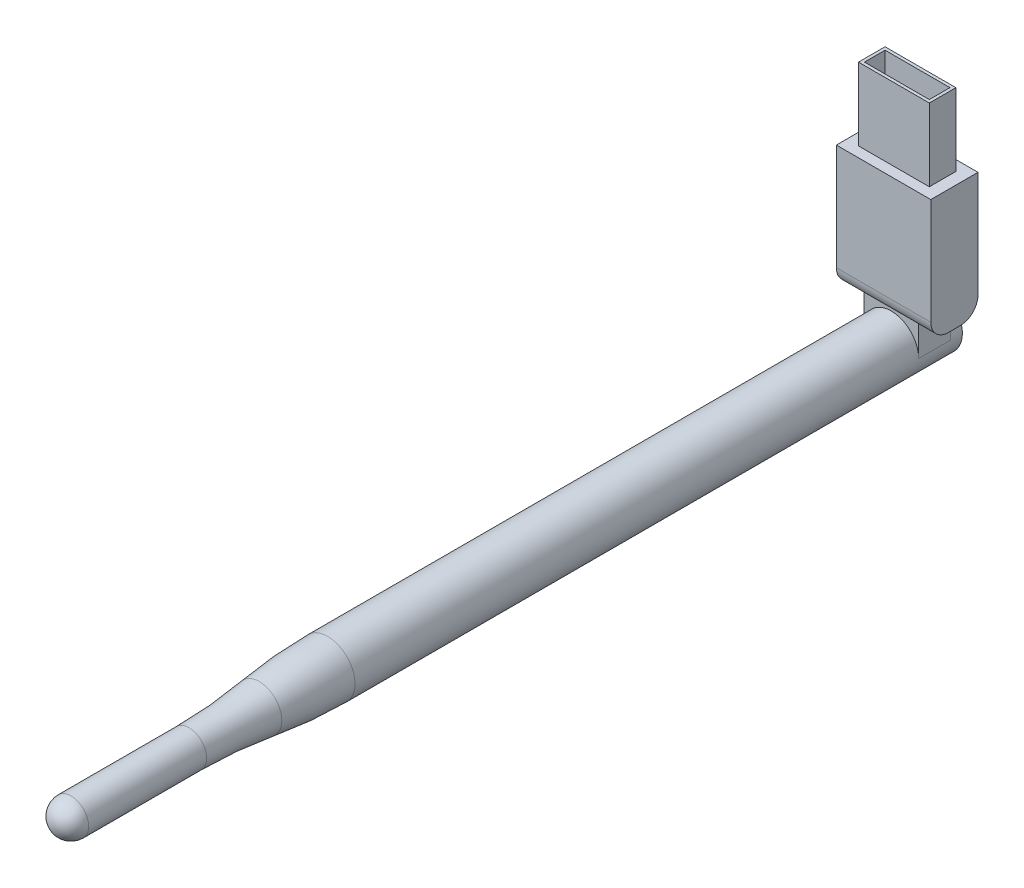
ISO-10303-21;
HEADER;
FILE_DESCRIPTION(('STEP AP214'),'2;1');
FILE_NAME('part.step','',(''),(''),'','','');
FILE_SCHEMA(('AUTOMOTIVE_DESIGN { 1 0 10303 214 1 1 1 1 }'));
ENDSEC;
DATA;
#1=APPLICATION_CONTEXT('core data for automotive mechanical design processes');
#2=APPLICATION_PROTOCOL_DEFINITION('international standard','automotive_design',2000,#1);
#3=PRODUCT_CONTEXT('',#1,'mechanical');
#4=PRODUCT('Part','Part','',(#3));
#5=PRODUCT_RELATED_PRODUCT_CATEGORY('part','',(#4));
#6=PRODUCT_DEFINITION_FORMATION('','',#4);
#7=PRODUCT_DEFINITION_CONTEXT('part definition',#1,'design');
#8=PRODUCT_DEFINITION('design','',#6,#7);
#9=PRODUCT_DEFINITION_SHAPE('','',#8);
#10=(LENGTH_UNIT() NAMED_UNIT(*) SI_UNIT(.MILLI.,.METRE.));
#11=(NAMED_UNIT(*) PLANE_ANGLE_UNIT() SI_UNIT($,.RADIAN.));
#12=(NAMED_UNIT(*) SI_UNIT($,.STERADIAN.) SOLID_ANGLE_UNIT());
#13=UNCERTAINTY_MEASURE_WITH_UNIT(LENGTH_MEASURE(1.E-05),#10,'distance_accuracy_value','');
#14=(GEOMETRIC_REPRESENTATION_CONTEXT(3) GLOBAL_UNCERTAINTY_ASSIGNED_CONTEXT((#13)) GLOBAL_UNIT_ASSIGNED_CONTEXT((#10,
#11,#12)) REPRESENTATION_CONTEXT('',''));
#15=CARTESIAN_POINT('',(0.,0.,0.));
#16=DIRECTION('',(0.,0.,1.));
#17=DIRECTION('',(1.,0.,0.));
#18=AXIS2_PLACEMENT_3D('',#15,#16,#17);
#19=CARTESIAN_POINT('',(0.,22.8,0.));
#20=DIRECTION('',(0.,1.,0.));
#21=DIRECTION('',(0.,0.,1.));
#22=AXIS2_PLACEMENT_3D('',#19,#20,#21);
#23=PLANE('',#22);
#24=DIRECTION('',(0.,0.,-1.));
#25=VECTOR('',#24,1.);
#26=CARTESIAN_POINT('',(6.,22.8,1.75));
#27=LINE('',#26,#25);
#28=CARTESIAN_POINT('',(6.,22.8,6.25));
#29=VERTEX_POINT('',#28);
#30=CARTESIAN_POINT('',(6.,22.8,1.75));
#31=VERTEX_POINT('',#30);
#32=EDGE_CURVE('E304',#29,#31,#27,.T.);
#33=ORIENTED_EDGE('',*,*,#32,.T.);
#34=DIRECTION('',(-1.,0.,0.));
#35=VECTOR('',#34,1.);
#36=CARTESIAN_POINT('',(-6.,22.8,1.75));
#37=LINE('',#36,#35);
#38=CARTESIAN_POINT('',(-6.,22.8,1.75));
#39=VERTEX_POINT('',#38);
#40=EDGE_CURVE('E307',#31,#39,#37,.T.);
#41=ORIENTED_EDGE('',*,*,#40,.T.);
#42=DIRECTION('',(0.,0.,1.));
#43=VECTOR('',#42,1.);
#44=CARTESIAN_POINT('',(-6.,22.8,1.75));
#45=LINE('',#44,#43);
#46=CARTESIAN_POINT('',(-6.,22.8,6.25));
#47=VERTEX_POINT('',#46);
#48=EDGE_CURVE('E310',#39,#47,#45,.T.);
#49=ORIENTED_EDGE('',*,*,#48,.T.);
#50=DIRECTION('',(1.,0.,0.));
#51=VECTOR('',#50,1.);
#52=CARTESIAN_POINT('',(-6.,22.8,6.25));
#53=LINE('',#52,#51);
#54=EDGE_CURVE('E312',#47,#29,#53,.T.);
#55=ORIENTED_EDGE('',*,*,#54,.T.);
#56=EDGE_LOOP('',(#33,#41,#49,#55));
#57=FACE_BOUND('',#56,.T.);
#58=DIRECTION('',(0.,0.,-1.));
#59=VECTOR('',#58,1.);
#60=CARTESIAN_POINT('',(5.5,22.8,5.75));
#61=LINE('',#60,#59);
#62=CARTESIAN_POINT('',(5.5,22.8,5.75));
#63=VERTEX_POINT('',#62);
#64=CARTESIAN_POINT('',(5.5,22.8,2.25));
#65=VERTEX_POINT('',#64);
#66=EDGE_CURVE('E206',#63,#65,#61,.T.);
#67=ORIENTED_EDGE('',*,*,#66,.F.);
#68=DIRECTION('',(1.,0.,0.));
#69=VECTOR('',#68,1.);
#70=CARTESIAN_POINT('',(-5.5,22.8,5.75));
#71=LINE('',#70,#69);
#72=CARTESIAN_POINT('',(-5.5,22.8,5.75));
#73=VERTEX_POINT('',#72);
#74=EDGE_CURVE('E195',#73,#63,#71,.T.);
#75=ORIENTED_EDGE('',*,*,#74,.F.);
#76=DIRECTION('',(0.,0.,1.));
#77=VECTOR('',#76,1.);
#78=CARTESIAN_POINT('',(-5.5,22.8,2.25));
#79=LINE('',#78,#77);
#80=CARTESIAN_POINT('',(-5.5,22.8,2.25));
#81=VERTEX_POINT('',#80);
#82=EDGE_CURVE('E220',#81,#73,#79,.T.);
#83=ORIENTED_EDGE('',*,*,#82,.F.);
#84=DIRECTION('',(-1.,0.,0.));
#85=VECTOR('',#84,1.);
#86=CARTESIAN_POINT('',(5.5,22.8,2.25));
#87=LINE('',#86,#85);
#88=EDGE_CURVE('E218',#65,#81,#87,.T.);
#89=ORIENTED_EDGE('',*,*,#88,.F.);
#90=EDGE_LOOP('',(#67,#75,#83,#89));
#91=FACE_BOUND('',#90,.T.);
#92=ADVANCED_FACE('F55',(#57,#91),#23,.T.);
#93=CARTESIAN_POINT('',(4.65,1.8,6.7));
#94=DIRECTION('',(1.,0.,0.));
#95=DIRECTION('',(0.,0.,-1.));
#96=AXIS2_PLACEMENT_3D('',#93,#94,#95);
#97=PLANE('',#96);
#98=DIRECTION('',(0.,-1.,0.));
#99=VECTOR('',#98,1.);
#100=CARTESIAN_POINT('',(4.65,1.8,6.7));
#101=LINE('',#100,#99);
#102=CARTESIAN_POINT('',(4.65,-9.97184141886166,6.7));
#103=VERTEX_POINT('',#102);
#104=CARTESIAN_POINT('',(4.65,-15.15,6.7));
#105=VERTEX_POINT('',#104);
#106=EDGE_CURVE('E78',#103,#105,#101,.T.);
#107=ORIENTED_EDGE('',*,*,#106,.T.);
#108=DIRECTION('',(0.,0.,1.));
#109=VECTOR('',#108,1.);
#110=CARTESIAN_POINT('',(4.65,-15.15,-0.699999999999997));
#111=LINE('',#110,#109);
#112=CARTESIAN_POINT('',(4.65,-15.15,1.3));
#113=VERTEX_POINT('',#112);
#114=EDGE_CURVE('E214',#113,#105,#111,.T.);
#115=ORIENTED_EDGE('',*,*,#114,.F.);
#116=DIRECTION('',(0.,-1.,0.));
#117=VECTOR('',#116,1.);
#118=CARTESIAN_POINT('',(4.65,1.8,1.3));
#119=LINE('',#118,#117);
#120=CARTESIAN_POINT('',(4.65,-9.97184141886166,1.3));
#121=VERTEX_POINT('',#120);
#122=EDGE_CURVE('E257',#121,#113,#119,.T.);
#123=ORIENTED_EDGE('',*,*,#122,.F.);
#124=CARTESIAN_POINT('',(4.65,-7.5,3.));
#125=DIRECTION('',(1.,0.,0.));
#126=DIRECTION('',(0.,0.,-1.));
#127=AXIS2_PLACEMENT_3D('',#124,#125,#126);
#128=CIRCLE('',#127,3.);
#129=CARTESIAN_POINT('',(4.65,-10.5,3.));
#130=VERTEX_POINT('',#129);
#131=EDGE_CURVE('E276',#130,#121,#128,.T.);
#132=ORIENTED_EDGE('',*,*,#131,.F.);
#133=DIRECTION('',(0.,0.,-1.));
#134=VECTOR('',#133,1.);
#135=CARTESIAN_POINT('',(4.65,-10.5,8.));
#136=LINE('',#135,#134);
#137=CARTESIAN_POINT('',(4.65,-10.5,4.99999999999998));
#138=VERTEX_POINT('',#137);
#139=EDGE_CURVE('E273',#138,#130,#136,.T.);
#140=ORIENTED_EDGE('',*,*,#139,.F.);
#141=CARTESIAN_POINT('',(4.65,-7.5,5.));
#142=DIRECTION('',(1.,0.,0.));
#143=DIRECTION('',(0.,0.,-1.));
#144=AXIS2_PLACEMENT_3D('',#141,#142,#143);
#145=CIRCLE('',#144,3.);
#146=EDGE_CURVE('E63',#103,#138,#145,.T.);
#147=ORIENTED_EDGE('',*,*,#146,.F.);
#148=EDGE_LOOP('',(#107,#115,#123,#132,#140,#147));
#149=FACE_BOUND('',#148,.T.);
#150=ADVANCED_FACE('F404',(#149),#97,.T.);
#151=CARTESIAN_POINT('',(-4.65,1.8,6.7));
#152=DIRECTION('',(-1.,0.,0.));
#153=DIRECTION('',(0.,0.,1.));
#154=AXIS2_PLACEMENT_3D('',#151,#152,#153);
#155=PLANE('',#154);
#156=DIRECTION('',(0.,-1.,0.));
#157=VECTOR('',#156,1.);
#158=CARTESIAN_POINT('',(-4.65,1.8,1.3));
#159=LINE('',#158,#157);
#160=CARTESIAN_POINT('',(-4.65,-9.97184141886166,1.3));
#161=VERTEX_POINT('',#160);
#162=CARTESIAN_POINT('',(-4.65,-15.15,1.3));
#163=VERTEX_POINT('',#162);
#164=EDGE_CURVE('E261',#161,#163,#159,.T.);
#165=ORIENTED_EDGE('',*,*,#164,.T.);
#166=DIRECTION('',(0.,0.,1.));
#167=VECTOR('',#166,1.);
#168=CARTESIAN_POINT('',(-4.65,-15.15,-0.699999999999997));
#169=LINE('',#168,#167);
#170=CARTESIAN_POINT('',(-4.65,-15.15,6.7));
#171=VERTEX_POINT('',#170);
#172=EDGE_CURVE('E234',#163,#171,#169,.T.);
#173=ORIENTED_EDGE('',*,*,#172,.T.);
#174=DIRECTION('',(0.,-1.,0.));
#175=VECTOR('',#174,1.);
#176=CARTESIAN_POINT('',(-4.65,1.8,6.7));
#177=LINE('',#176,#175);
#178=CARTESIAN_POINT('',(-4.65,-9.97184141886166,6.7));
#179=VERTEX_POINT('',#178);
#180=EDGE_CURVE('E264',#179,#171,#177,.T.);
#181=ORIENTED_EDGE('',*,*,#180,.F.);
#182=CARTESIAN_POINT('',(-4.65,-7.5,5.));
#183=DIRECTION('',(-1.,0.,0.));
#184=DIRECTION('',(0.,0.,1.));
#185=AXIS2_PLACEMENT_3D('',#182,#183,#184);
#186=CIRCLE('',#185,3.);
#187=CARTESIAN_POINT('',(-4.65,-10.5,4.99999999999998));
#188=VERTEX_POINT('',#187);
#189=EDGE_CURVE('E365',#188,#179,#186,.T.);
#190=ORIENTED_EDGE('',*,*,#189,.F.);
#191=DIRECTION('',(0.,0.,1.));
#192=VECTOR('',#191,1.);
#193=CARTESIAN_POINT('',(-4.65,-10.5,8.));
#194=LINE('',#193,#192);
#195=CARTESIAN_POINT('',(-4.65,-10.5,3.));
#196=VERTEX_POINT('',#195);
#197=EDGE_CURVE('E260',#196,#188,#194,.T.);
#198=ORIENTED_EDGE('',*,*,#197,.F.);
#199=CARTESIAN_POINT('',(-4.65,-7.5,3.));
#200=DIRECTION('',(-1.,0.,0.));
#201=DIRECTION('',(0.,0.,1.));
#202=AXIS2_PLACEMENT_3D('',#199,#200,#201);
#203=CIRCLE('',#202,3.);
#204=EDGE_CURVE('E270',#161,#196,#203,.T.);
#205=ORIENTED_EDGE('',*,*,#204,.F.);
#206=EDGE_LOOP('',(#165,#173,#181,#190,#198,#205));
#207=FACE_BOUND('',#206,.T.);
#208=ADVANCED_FACE('F395',(#207),#155,.T.);
#209=CARTESIAN_POINT('',(-4.65,1.8,1.3));
#210=DIRECTION('',(0.,0.,-1.));
#211=DIRECTION('',(-1.,0.,0.));
#212=AXIS2_PLACEMENT_3D('',#209,#210,#211);
#213=PLANE('',#212);
#214=CARTESIAN_POINT('',(0.,-15.15,1.3));
#215=DIRECTION('',(0.,0.,-1.));
#216=DIRECTION('',(-1.,0.,0.));
#217=AXIS2_PLACEMENT_3D('',#214,#215,#216);
#218=CIRCLE('',#217,4.65);
#219=EDGE_CURVE('E254',#163,#113,#218,.T.);
#220=ORIENTED_EDGE('',*,*,#219,.F.);
#221=ORIENTED_EDGE('',*,*,#164,.F.);
#222=DIRECTION('',(1.,0.,0.));
#223=VECTOR('',#222,1.);
#224=CARTESIAN_POINT('',(-8.,-9.97184141886166,1.3));
#225=LINE('',#224,#223);
#226=EDGE_CURVE('E12',#121,#161,#225,.F.);
#227=ORIENTED_EDGE('',*,*,#226,.F.);
#228=ORIENTED_EDGE('',*,*,#122,.T.);
#229=EDGE_LOOP('',(#220,#221,#227,#228));
#230=FACE_BOUND('',#229,.T.);
#231=ADVANCED_FACE('F403',(#230),#213,.T.);
#232=CARTESIAN_POINT('',(-4.65,1.8,6.7));
#233=DIRECTION('',(0.,0.,1.));
#234=DIRECTION('',(1.,0.,0.));
#235=AXIS2_PLACEMENT_3D('',#232,#233,#234);
#236=PLANE('',#235);
#237=CARTESIAN_POINT('',(0.,-15.15,6.7));
#238=DIRECTION('',(0.,0.,1.));
#239=DIRECTION('',(1.,0.,0.));
#240=AXIS2_PLACEMENT_3D('',#237,#238,#239);
#241=CIRCLE('',#240,4.65);
#242=EDGE_CURVE('E251',#105,#171,#241,.T.);
#243=ORIENTED_EDGE('',*,*,#242,.F.);
#244=ORIENTED_EDGE('',*,*,#106,.F.);
#245=DIRECTION('',(1.,0.,0.));
#246=VECTOR('',#245,1.);
#247=CARTESIAN_POINT('',(-8.,-9.97184141886166,6.7));
#248=LINE('',#247,#246);
#249=EDGE_CURVE('E362',#179,#103,#248,.T.);
#250=ORIENTED_EDGE('',*,*,#249,.F.);
#251=ORIENTED_EDGE('',*,*,#180,.T.);
#252=EDGE_LOOP('',(#243,#244,#250,#251));
#253=FACE_BOUND('',#252,.T.);
#254=ADVANCED_FACE('F408',(#253),#236,.T.);
#255=CARTESIAN_POINT('',(-8.,-10.5,8.));
#256=DIRECTION('',(0.,1.,0.));
#257=DIRECTION('',(0.,0.,1.));
#258=AXIS2_PLACEMENT_3D('',#255,#256,#257);
#259=PLANE('',#258);
#260=DIRECTION('',(1.,0.,0.));
#261=VECTOR('',#260,1.);
#262=CARTESIAN_POINT('',(-8.,-10.5,4.99999999999998));
#263=LINE('',#262,#261);
#264=CARTESIAN_POINT('',(8.,-10.5,4.99999999999998));
#265=VERTEX_POINT('',#264);
#266=EDGE_CURVE('E295',#138,#265,#263,.T.);
#267=ORIENTED_EDGE('',*,*,#266,.F.);
#268=ORIENTED_EDGE('',*,*,#139,.T.);
#269=DIRECTION('',(1.,0.,0.));
#270=VECTOR('',#269,1.);
#271=CARTESIAN_POINT('',(-8.,-10.5,3.00000000000002));
#272=LINE('',#271,#270);
#273=CARTESIAN_POINT('',(8.,-10.5,3.00000000000002));
#274=VERTEX_POINT('',#273);
#275=EDGE_CURVE('E299',#130,#274,#272,.T.);
#276=ORIENTED_EDGE('',*,*,#275,.T.);
#277=DIRECTION('',(0.,0.,-1.));
#278=VECTOR('',#277,1.);
#279=CARTESIAN_POINT('',(8.,-10.5,8.));
#280=LINE('',#279,#278);
#281=EDGE_CURVE('E345',#265,#274,#280,.T.);
#282=ORIENTED_EDGE('',*,*,#281,.F.);
#283=EDGE_LOOP('',(#267,#268,#276,#282));
#284=FACE_BOUND('',#283,.T.);
#285=ADVANCED_FACE('F375',(#284),#259,.F.);
#286=CARTESIAN_POINT('',(-8.,-10.5,3.00000000000002));
#287=VERTEX_POINT('',#286);
#288=EDGE_CURVE('E296',#287,#196,#272,.T.);
#289=ORIENTED_EDGE('',*,*,#288,.T.);
#290=ORIENTED_EDGE('',*,*,#197,.T.);
#291=CARTESIAN_POINT('',(-8.,-10.5,4.99999999999998));
#292=VERTEX_POINT('',#291);
#293=EDGE_CURVE('E291',#292,#188,#263,.T.);
#294=ORIENTED_EDGE('',*,*,#293,.F.);
#295=DIRECTION('',(0.,0.,-1.));
#296=VECTOR('',#295,1.);
#297=CARTESIAN_POINT('',(-8.,-10.5,8.));
#298=LINE('',#297,#296);
#299=EDGE_CURVE('E353',#292,#287,#298,.T.);
#300=ORIENTED_EDGE('',*,*,#299,.T.);
#301=EDGE_LOOP('',(#289,#290,#294,#300));
#302=FACE_BOUND('',#301,.T.);
#303=ADVANCED_FACE('F393',(#302),#259,.F.);
#304=CARTESIAN_POINT('',(-8.,10.5,8.));
#305=DIRECTION('',(0.,-1.,0.));
#306=DIRECTION('',(0.,0.,-1.));
#307=AXIS2_PLACEMENT_3D('',#304,#305,#306);
#308=PLANE('',#307);
#309=DIRECTION('',(-1.,0.,0.));
#310=VECTOR('',#309,1.);
#311=CARTESIAN_POINT('',(-8.,10.5,0.));
#312=LINE('',#311,#310);
#313=CARTESIAN_POINT('',(8.,10.5,0.));
#314=VERTEX_POINT('',#313);
#315=CARTESIAN_POINT('',(-8.,10.5,0.));
#316=VERTEX_POINT('',#315);
#317=EDGE_CURVE('E347',#314,#316,#312,.T.);
#318=ORIENTED_EDGE('',*,*,#317,.T.);
#319=DIRECTION('',(0.,0.,-1.));
#320=VECTOR('',#319,1.);
#321=CARTESIAN_POINT('',(-8.,10.5,8.));
#322=LINE('',#321,#320);
#323=CARTESIAN_POINT('',(-8.,10.5,8.));
#324=VERTEX_POINT('',#323);
#325=EDGE_CURVE('E356',#324,#316,#322,.T.);
#326=ORIENTED_EDGE('',*,*,#325,.F.);
#327=DIRECTION('',(-1.,0.,0.));
#328=VECTOR('',#327,1.);
#329=CARTESIAN_POINT('',(-8.,10.5,8.));
#330=LINE('',#329,#328);
#331=CARTESIAN_POINT('',(8.,10.5,8.));
#332=VERTEX_POINT('',#331);
#333=EDGE_CURVE('E339',#332,#324,#330,.T.);
#334=ORIENTED_EDGE('',*,*,#333,.F.);
#335=DIRECTION('',(0.,0.,-1.));
#336=VECTOR('',#335,1.);
#337=CARTESIAN_POINT('',(8.,10.5,8.));
#338=LINE('',#337,#336);
#339=EDGE_CURVE('E359',#332,#314,#338,.T.);
#340=ORIENTED_EDGE('',*,*,#339,.T.);
#341=EDGE_LOOP('',(#318,#326,#334,#340));
#342=FACE_BOUND('',#341,.T.);
#343=DIRECTION('',(0.,0.,-1.));
#344=VECTOR('',#343,1.);
#345=CARTESIAN_POINT('',(6.,10.5,1.75));
#346=LINE('',#345,#344);
#347=CARTESIAN_POINT('',(6.,10.5,6.25));
#348=VERTEX_POINT('',#347);
#349=CARTESIAN_POINT('',(6.,10.5,1.75));
#350=VERTEX_POINT('',#349);
#351=EDGE_CURVE('E294',#348,#350,#346,.T.);
#352=ORIENTED_EDGE('',*,*,#351,.F.);
#353=DIRECTION('',(1.,0.,0.));
#354=VECTOR('',#353,1.);
#355=CARTESIAN_POINT('',(-6.,10.5,6.25));
#356=LINE('',#355,#354);
#357=CARTESIAN_POINT('',(-6.,10.5,6.25));
#358=VERTEX_POINT('',#357);
#359=EDGE_CURVE('E308',#358,#348,#356,.T.);
#360=ORIENTED_EDGE('',*,*,#359,.F.);
#361=DIRECTION('',(0.,0.,1.));
#362=VECTOR('',#361,1.);
#363=CARTESIAN_POINT('',(-6.,10.5,1.75));
#364=LINE('',#363,#362);
#365=CARTESIAN_POINT('',(-6.,10.5,1.75));
#366=VERTEX_POINT('',#365);
#367=EDGE_CURVE('E320',#366,#358,#364,.T.);
#368=ORIENTED_EDGE('',*,*,#367,.F.);
#369=DIRECTION('',(-1.,0.,0.));
#370=VECTOR('',#369,1.);
#371=CARTESIAN_POINT('',(-6.,10.5,1.75));
#372=LINE('',#371,#370);
#373=EDGE_CURVE('E317',#350,#366,#372,.T.);
#374=ORIENTED_EDGE('',*,*,#373,.F.);
#375=EDGE_LOOP('',(#352,#360,#368,#374));
#376=FACE_BOUND('',#375,.T.);
#377=ADVANCED_FACE('F451',(#342,#376),#308,.F.);
#378=CARTESIAN_POINT('',(8.,10.5,8.));
#379=DIRECTION('',(-1.,0.,0.));
#380=DIRECTION('',(0.,-1.,0.));
#381=AXIS2_PLACEMENT_3D('',#378,#379,#380);
#382=PLANE('',#381);
#383=DIRECTION('',(0.,1.,0.));
#384=VECTOR('',#383,1.);
#385=CARTESIAN_POINT('',(8.,10.5,8.));
#386=LINE('',#385,#384);
#387=CARTESIAN_POINT('',(8.,-7.49999999999998,8.));
#388=VERTEX_POINT('',#387);
#389=EDGE_CURVE('E337',#388,#332,#386,.T.);
#390=ORIENTED_EDGE('',*,*,#389,.F.);
#391=CARTESIAN_POINT('',(8.,-7.5,5.));
#392=DIRECTION('',(-1.,0.,0.));
#393=DIRECTION('',(0.,1.,0.));
#394=AXIS2_PLACEMENT_3D('',#391,#392,#393);
#395=CIRCLE('',#394,3.);
#396=EDGE_CURVE('E279',#265,#388,#395,.T.);
#397=ORIENTED_EDGE('',*,*,#396,.F.);
#398=ORIENTED_EDGE('',*,*,#281,.T.);
#399=CARTESIAN_POINT('',(8.,-7.5,3.));
#400=DIRECTION('',(-1.,0.,0.));
#401=DIRECTION('',(0.,-1.,0.));
#402=AXIS2_PLACEMENT_3D('',#399,#400,#401);
#403=CIRCLE('',#402,3.);
#404=CARTESIAN_POINT('',(8.,-7.49999999999998,0.));
#405=VERTEX_POINT('',#404);
#406=EDGE_CURVE('E284',#405,#274,#403,.T.);
#407=ORIENTED_EDGE('',*,*,#406,.F.);
#408=DIRECTION('',(0.,1.,0.));
#409=VECTOR('',#408,1.);
#410=CARTESIAN_POINT('',(8.,10.5,0.));
#411=LINE('',#410,#409);
#412=EDGE_CURVE('E336',#405,#314,#411,.T.);
#413=ORIENTED_EDGE('',*,*,#412,.T.);
#414=ORIENTED_EDGE('',*,*,#339,.F.);
#415=EDGE_LOOP('',(#390,#397,#398,#407,#413,#414));
#416=FACE_BOUND('',#415,.T.);
#417=ADVANCED_FACE('F57',(#416),#382,.F.);
#418=CARTESIAN_POINT('',(-8.,10.5,8.));
#419=DIRECTION('',(1.,0.,0.));
#420=DIRECTION('',(0.,0.,-1.));
#421=AXIS2_PLACEMENT_3D('',#418,#419,#420);
#422=PLANE('',#421);
#423=ORIENTED_EDGE('',*,*,#299,.F.);
#424=CARTESIAN_POINT('',(-8.,-7.50000000000001,5.));
#425=DIRECTION('',(-1.,0.,0.));
#426=DIRECTION('',(0.,1.,0.));
#427=AXIS2_PLACEMENT_3D('',#424,#425,#426);
#428=CIRCLE('',#427,3.);
#429=CARTESIAN_POINT('',(-8.,-7.49999999999998,8.));
#430=VERTEX_POINT('',#429);
#431=EDGE_CURVE('E280',#292,#430,#428,.T.);
#432=ORIENTED_EDGE('',*,*,#431,.T.);
#433=DIRECTION('',(0.,-1.,0.));
#434=VECTOR('',#433,1.);
#435=CARTESIAN_POINT('',(-8.,10.5,8.));
#436=LINE('',#435,#434);
#437=EDGE_CURVE('E342',#324,#430,#436,.T.);
#438=ORIENTED_EDGE('',*,*,#437,.F.);
#439=ORIENTED_EDGE('',*,*,#325,.T.);
#440=DIRECTION('',(0.,-1.,0.));
#441=VECTOR('',#440,1.);
#442=CARTESIAN_POINT('',(-8.,10.5,0.));
#443=LINE('',#442,#441);
#444=CARTESIAN_POINT('',(-8.,-7.49999999999998,0.));
#445=VERTEX_POINT('',#444);
#446=EDGE_CURVE('E340',#316,#445,#443,.T.);
#447=ORIENTED_EDGE('',*,*,#446,.T.);
#448=CARTESIAN_POINT('',(-8.,-7.50000000000001,3.));
#449=DIRECTION('',(-1.,0.,0.));
#450=DIRECTION('',(0.,-1.,0.));
#451=AXIS2_PLACEMENT_3D('',#448,#449,#450);
#452=CIRCLE('',#451,3.);
#453=EDGE_CURVE('E283',#445,#287,#452,.T.);
#454=ORIENTED_EDGE('',*,*,#453,.T.);
#455=EDGE_LOOP('',(#423,#432,#438,#439,#447,#454));
#456=FACE_BOUND('',#455,.T.);
#457=ADVANCED_FACE('F389',(#456),#422,.F.);
#458=CARTESIAN_POINT('',(0.,0.,8.));
#459=DIRECTION('',(0.,0.,1.));
#460=DIRECTION('',(1.,0.,0.));
#461=AXIS2_PLACEMENT_3D('',#458,#459,#460);
#462=PLANE('',#461);
#463=DIRECTION('',(1.,0.,0.));
#464=VECTOR('',#463,1.);
#465=CARTESIAN_POINT('',(-8.,-7.49999999999998,8.));
#466=LINE('',#465,#464);
#467=EDGE_CURVE('E287',#430,#388,#466,.T.);
#468=ORIENTED_EDGE('',*,*,#467,.T.);
#469=ORIENTED_EDGE('',*,*,#389,.T.);
#470=ORIENTED_EDGE('',*,*,#333,.T.);
#471=ORIENTED_EDGE('',*,*,#437,.T.);
#472=EDGE_LOOP('',(#468,#469,#470,#471));
#473=FACE_BOUND('',#472,.T.);
#474=ADVANCED_FACE('F383',(#473),#462,.T.);
#475=CARTESIAN_POINT('',(0.,0.,0.));
#476=DIRECTION('',(0.,0.,1.));
#477=DIRECTION('',(1.,0.,0.));
#478=AXIS2_PLACEMENT_3D('',#475,#476,#477);
#479=PLANE('',#478);
#480=ORIENTED_EDGE('',*,*,#412,.F.);
#481=DIRECTION('',(1.,0.,0.));
#482=VECTOR('',#481,1.);
#483=CARTESIAN_POINT('',(-8.,-7.49999999999998,0.));
#484=LINE('',#483,#482);
#485=EDGE_CURVE('E300',#445,#405,#484,.T.);
#486=ORIENTED_EDGE('',*,*,#485,.F.);
#487=ORIENTED_EDGE('',*,*,#446,.F.);
#488=ORIENTED_EDGE('',*,*,#317,.F.);
#489=EDGE_LOOP('',(#480,#486,#487,#488));
#490=FACE_BOUND('',#489,.T.);
#491=ADVANCED_FACE('F443',(#490),#479,.F.);
#492=CARTESIAN_POINT('',(6.,22.8,1.75));
#493=DIRECTION('',(-1.,0.,0.));
#494=DIRECTION('',(0.,0.,1.));
#495=AXIS2_PLACEMENT_3D('',#492,#493,#494);
#496=PLANE('',#495);
#497=ORIENTED_EDGE('',*,*,#351,.T.);
#498=DIRECTION('',(0.,-1.,0.));
#499=VECTOR('',#498,1.);
#500=CARTESIAN_POINT('',(6.,22.8,1.75));
#501=LINE('',#500,#499);
#502=EDGE_CURVE('E333',#31,#350,#501,.T.);
#503=ORIENTED_EDGE('',*,*,#502,.F.);
#504=ORIENTED_EDGE('',*,*,#32,.F.);
#505=DIRECTION('',(0.,-1.,0.));
#506=VECTOR('',#505,1.);
#507=CARTESIAN_POINT('',(6.,22.8,6.25));
#508=LINE('',#507,#506);
#509=EDGE_CURVE('E314',#29,#348,#508,.T.);
#510=ORIENTED_EDGE('',*,*,#509,.T.);
#511=EDGE_LOOP('',(#497,#503,#504,#510));
#512=FACE_BOUND('',#511,.T.);
#513=ADVANCED_FACE('F439',(#512),#496,.F.);
#514=CARTESIAN_POINT('',(-6.,22.8,1.75));
#515=DIRECTION('',(0.,0.,1.));
#516=DIRECTION('',(1.,0.,0.));
#517=AXIS2_PLACEMENT_3D('',#514,#515,#516);
#518=PLANE('',#517);
#519=ORIENTED_EDGE('',*,*,#373,.T.);
#520=DIRECTION('',(0.,-1.,0.));
#521=VECTOR('',#520,1.);
#522=CARTESIAN_POINT('',(-6.,22.8,1.75));
#523=LINE('',#522,#521);
#524=EDGE_CURVE('E330',#39,#366,#523,.T.);
#525=ORIENTED_EDGE('',*,*,#524,.F.);
#526=ORIENTED_EDGE('',*,*,#40,.F.);
#527=ORIENTED_EDGE('',*,*,#502,.T.);
#528=EDGE_LOOP('',(#519,#525,#526,#527));
#529=FACE_BOUND('',#528,.T.);
#530=ADVANCED_FACE('F435',(#529),#518,.F.);
#531=CARTESIAN_POINT('',(-6.,22.8,1.75));
#532=DIRECTION('',(1.,0.,0.));
#533=DIRECTION('',(0.,0.,-1.));
#534=AXIS2_PLACEMENT_3D('',#531,#532,#533);
#535=PLANE('',#534);
#536=ORIENTED_EDGE('',*,*,#367,.T.);
#537=DIRECTION('',(0.,-1.,0.));
#538=VECTOR('',#537,1.);
#539=CARTESIAN_POINT('',(-6.,22.8,6.25));
#540=LINE('',#539,#538);
#541=EDGE_CURVE('E327',#47,#358,#540,.T.);
#542=ORIENTED_EDGE('',*,*,#541,.F.);
#543=ORIENTED_EDGE('',*,*,#48,.F.);
#544=ORIENTED_EDGE('',*,*,#524,.T.);
#545=EDGE_LOOP('',(#536,#542,#543,#544));
#546=FACE_BOUND('',#545,.T.);
#547=ADVANCED_FACE('F431',(#546),#535,.F.);
#548=CARTESIAN_POINT('',(-6.,22.8,6.25));
#549=DIRECTION('',(0.,0.,-1.));
#550=DIRECTION('',(-1.,0.,0.));
#551=AXIS2_PLACEMENT_3D('',#548,#549,#550);
#552=PLANE('',#551);
#553=ORIENTED_EDGE('',*,*,#359,.T.);
#554=ORIENTED_EDGE('',*,*,#509,.F.);
#555=ORIENTED_EDGE('',*,*,#54,.F.);
#556=ORIENTED_EDGE('',*,*,#541,.T.);
#557=EDGE_LOOP('',(#553,#554,#555,#556));
#558=FACE_BOUND('',#557,.T.);
#559=ADVANCED_FACE('F428',(#558),#552,.F.);
#560=CARTESIAN_POINT('',(-8.,-7.50000000000001,3.));
#561=DIRECTION('',(1.,0.,0.));
#562=DIRECTION('',(0.,1.,0.));
#563=AXIS2_PLACEMENT_3D('',#560,#561,#562);
#564=CYLINDRICAL_SURFACE('',#563,3.);
#565=ORIENTED_EDGE('',*,*,#275,.F.);
#566=ORIENTED_EDGE('',*,*,#131,.T.);
#567=ORIENTED_EDGE('',*,*,#226,.T.);
#568=ORIENTED_EDGE('',*,*,#204,.T.);
#569=ORIENTED_EDGE('',*,*,#288,.F.);
#570=ORIENTED_EDGE('',*,*,#453,.F.);
#571=ORIENTED_EDGE('',*,*,#485,.T.);
#572=ORIENTED_EDGE('',*,*,#406,.T.);
#573=EDGE_LOOP('',(#565,#566,#567,#568,#569,#570,#571,#572));
#574=FACE_BOUND('',#573,.T.);
#575=ADVANCED_FACE('F399',(#574),#564,.T.);
#576=CARTESIAN_POINT('',(-8.,-7.50000000000001,5.));
#577=DIRECTION('',(1.,0.,0.));
#578=DIRECTION('',(0.,1.,0.));
#579=AXIS2_PLACEMENT_3D('',#576,#577,#578);
#580=CYLINDRICAL_SURFACE('',#579,3.);
#581=ORIENTED_EDGE('',*,*,#249,.T.);
#582=ORIENTED_EDGE('',*,*,#146,.T.);
#583=ORIENTED_EDGE('',*,*,#266,.T.);
#584=ORIENTED_EDGE('',*,*,#396,.T.);
#585=ORIENTED_EDGE('',*,*,#467,.F.);
#586=ORIENTED_EDGE('',*,*,#431,.F.);
#587=ORIENTED_EDGE('',*,*,#293,.T.);
#588=ORIENTED_EDGE('',*,*,#189,.T.);
#589=EDGE_LOOP('',(#581,#582,#583,#584,#585,#586,#587,#588));
#590=FACE_BOUND('',#589,.T.);
#591=ADVANCED_FACE('F370',(#590),#580,.T.);
#592=CARTESIAN_POINT('',(0.,-15.15,102.206246164213));
#593=DIRECTION('',(0.,0.,-1.));
#594=DIRECTION('',(0.,1.,0.));
#595=AXIS2_PLACEMENT_3D('',#592,#593,#594);
#596=DEGENERATE_TOROIDAL_SURFACE('',#595,78.3229190554853,82.9729190554853,.F.);
#597=CARTESIAN_POINT('',(0.,-15.15,113.803656491009));
#598=DIRECTION('',(0.,0.,-1.));
#599=DIRECTION('',(0.,1.,0.));
#600=AXIS2_PLACEMENT_3D('',#597,#598,#599);
#601=CIRCLE('',#600,3.83549725288835);
#602=CARTESIAN_POINT('',(0.,-11.3145027471117,113.803656491009));
#603=VERTEX_POINT('',#602);
#604=EDGE_CURVE('E242',#603,#603,#601,.T.);
#605=ORIENTED_EDGE('',*,*,#604,.T.);
#606=EDGE_LOOP('',(#605));
#607=FACE_BOUND('',#606,.T.);
#608=CARTESIAN_POINT('',(0.,-15.15,102.206246164213));
#609=DIRECTION('',(0.,0.,-1.));
#610=DIRECTION('',(0.,1.,0.));
#611=AXIS2_PLACEMENT_3D('',#608,#609,#610);
#612=CIRCLE('',#611,4.65);
#613=CARTESIAN_POINT('',(0.,-10.5,102.206246164213));
#614=VERTEX_POINT('',#613);
#615=EDGE_CURVE('E239',#614,#614,#612,.T.);
#616=ORIENTED_EDGE('',*,*,#615,.F.);
#617=EDGE_LOOP('',(#616));
#618=FACE_BOUND('',#617,.T.);
#619=ADVANCED_FACE('F512',(#607,#618),#596,.F.);
#620=CARTESIAN_POINT('',(0.,-15.15,125.7));
#621=DIRECTION('',(0.,0.,-1.));
#622=DIRECTION('',(0.,1.,0.));
#623=AXIS2_PLACEMENT_3D('',#620,#621,#622);
#624=TOROIDAL_SURFACE('',#623,88.1116170949826,85.1116170949826);
#625=CARTESIAN_POINT('',(0.,-15.15,125.7));
#626=DIRECTION('',(0.,0.,-1.));
#627=DIRECTION('',(0.,1.,0.));
#628=AXIS2_PLACEMENT_3D('',#625,#626,#627);
#629=CIRCLE('',#628,3.);
#630=CARTESIAN_POINT('',(0.,-12.15,125.7));
#631=VERTEX_POINT('',#630);
#632=EDGE_CURVE('E245',#631,#631,#629,.T.);
#633=ORIENTED_EDGE('',*,*,#632,.T.);
#634=EDGE_LOOP('',(#633));
#635=FACE_BOUND('',#634,.T.);
#636=ORIENTED_EDGE('',*,*,#604,.F.);
#637=EDGE_LOOP('',(#636));
#638=FACE_BOUND('',#637,.T.);
#639=ADVANCED_FACE('F518',(#635,#638),#624,.F.);
#640=CARTESIAN_POINT('',(0.,-15.15,6.7));
#641=DIRECTION('',(0.,0.,-1.));
#642=DIRECTION('',(0.,1.,0.));
#643=AXIS2_PLACEMENT_3D('',#640,#641,#642);
#644=CYLINDRICAL_SURFACE('',#643,2.99999999999999);
#645=ORIENTED_EDGE('',*,*,#632,.F.);
#646=EDGE_LOOP('',(#645));
#647=FACE_BOUND('',#646,.T.);
#648=CARTESIAN_POINT('',(0.,-15.15,145.7));
#649=DIRECTION('',(0.,0.,-1.));
#650=DIRECTION('',(0.,1.,0.));
#651=AXIS2_PLACEMENT_3D('',#648,#649,#650);
#652=CIRCLE('',#651,2.99999999999999);
#653=CARTESIAN_POINT('',(0.,-12.15,145.7));
#654=VERTEX_POINT('',#653);
#655=EDGE_CURVE('E248',#654,#654,#652,.T.);
#656=ORIENTED_EDGE('',*,*,#655,.T.);
#657=EDGE_LOOP('',(#656));
#658=FACE_BOUND('',#657,.T.);
#659=ADVANCED_FACE('F526',(#647,#658),#644,.T.);
#660=CARTESIAN_POINT('',(0.,-15.15,145.7));
#661=DIRECTION('',(0.,0.,-1.));
#662=DIRECTION('',(0.,1.,0.));
#663=AXIS2_PLACEMENT_3D('',#660,#661,#662);
#664=SPHERICAL_SURFACE('',#663,3.);
#665=ORIENTED_EDGE('',*,*,#655,.F.);
#666=EDGE_LOOP('',(#665));
#667=FACE_BOUND('',#666,.T.);
#668=ADVANCED_FACE('F534',(#667),#664,.T.);
#669=CARTESIAN_POINT('',(0.,-15.15,6.7));
#670=DIRECTION('',(0.,0.,-1.));
#671=DIRECTION('',(0.,1.,0.));
#672=AXIS2_PLACEMENT_3D('',#669,#670,#671);
#673=CYLINDRICAL_SURFACE('',#672,4.65);
#674=ORIENTED_EDGE('',*,*,#219,.T.);
#675=ORIENTED_EDGE('',*,*,#114,.T.);
#676=ORIENTED_EDGE('',*,*,#242,.T.);
#677=ORIENTED_EDGE('',*,*,#172,.F.);
#678=EDGE_LOOP('',(#674,#675,#676,#677));
#679=FACE_BOUND('',#678,.T.);
#680=CARTESIAN_POINT('',(0.,-15.15,-0.699999999999998));
#681=DIRECTION('',(0.,0.,-1.));
#682=DIRECTION('',(0.,1.,0.));
#683=AXIS2_PLACEMENT_3D('',#680,#681,#682);
#684=CIRCLE('',#683,4.65);
#685=CARTESIAN_POINT('',(0.,-10.5,-0.699999999999997));
#686=VERTEX_POINT('',#685);
#687=EDGE_CURVE('E236',#686,#686,#684,.T.);
#688=ORIENTED_EDGE('',*,*,#687,.F.);
#689=EDGE_LOOP('',(#688));
#690=FACE_BOUND('',#689,.T.);
#691=ORIENTED_EDGE('',*,*,#615,.T.);
#692=EDGE_LOOP('',(#691));
#693=FACE_BOUND('',#692,.T.);
#694=ADVANCED_FACE('F406',(#679,#690,#693),#673,.T.);
#695=CARTESIAN_POINT('',(0.,0.,-0.699999999999996));
#696=DIRECTION('',(0.,0.,-1.));
#697=DIRECTION('',(0.,1.,0.));
#698=AXIS2_PLACEMENT_3D('',#695,#696,#697);
#699=PLANE('',#698);
#700=ORIENTED_EDGE('',*,*,#687,.T.);
#701=EDGE_LOOP('',(#700));
#702=FACE_BOUND('',#701,.T.);
#703=ADVANCED_FACE('F550',(#702),#699,.T.);
#704=CARTESIAN_POINT('',(-5.5,22.8,5.75));
#705=DIRECTION('',(0.,0.,-1.));
#706=DIRECTION('',(-1.,0.,0.));
#707=AXIS2_PLACEMENT_3D('',#704,#705,#706);
#708=PLANE('',#707);
#709=DIRECTION('',(1.,0.,0.));
#710=VECTOR('',#709,1.);
#711=CARTESIAN_POINT('',(-5.5,14.25,5.75));
#712=LINE('',#711,#710);
#713=CARTESIAN_POINT('',(-5.5,14.25,5.75));
#714=VERTEX_POINT('',#713);
#715=CARTESIAN_POINT('',(5.5,14.25,5.75));
#716=VERTEX_POINT('',#715);
#717=EDGE_CURVE('E224',#714,#716,#712,.T.);
#718=ORIENTED_EDGE('',*,*,#717,.F.);
#719=DIRECTION('',(0.,-1.,0.));
#720=VECTOR('',#719,1.);
#721=CARTESIAN_POINT('',(-5.5,22.8,5.75));
#722=LINE('',#721,#720);
#723=EDGE_CURVE('E202',#73,#714,#722,.T.);
#724=ORIENTED_EDGE('',*,*,#723,.F.);
#725=ORIENTED_EDGE('',*,*,#74,.T.);
#726=DIRECTION('',(0.,-1.,0.));
#727=VECTOR('',#726,1.);
#728=CARTESIAN_POINT('',(5.5,22.8,5.75));
#729=LINE('',#728,#727);
#730=EDGE_CURVE('E199',#63,#716,#729,.T.);
#731=ORIENTED_EDGE('',*,*,#730,.T.);
#732=EDGE_LOOP('',(#718,#724,#725,#731));
#733=FACE_BOUND('',#732,.T.);
#734=ADVANCED_FACE('F198',(#733),#708,.T.);
#735=CARTESIAN_POINT('',(5.5,22.8,5.75));
#736=DIRECTION('',(-1.,0.,0.));
#737=DIRECTION('',(0.,0.,1.));
#738=AXIS2_PLACEMENT_3D('',#735,#736,#737);
#739=PLANE('',#738);
#740=DIRECTION('',(0.,0.,-1.));
#741=VECTOR('',#740,1.);
#742=CARTESIAN_POINT('',(5.5,14.25,5.75));
#743=LINE('',#742,#741);
#744=CARTESIAN_POINT('',(5.5,14.25,2.25));
#745=VERTEX_POINT('',#744);
#746=EDGE_CURVE('E213',#716,#745,#743,.T.);
#747=ORIENTED_EDGE('',*,*,#746,.F.);
#748=ORIENTED_EDGE('',*,*,#730,.F.);
#749=ORIENTED_EDGE('',*,*,#66,.T.);
#750=DIRECTION('',(0.,-1.,0.));
#751=VECTOR('',#750,1.);
#752=CARTESIAN_POINT('',(5.5,22.8,2.25));
#753=LINE('',#752,#751);
#754=EDGE_CURVE('E215',#65,#745,#753,.T.);
#755=ORIENTED_EDGE('',*,*,#754,.T.);
#756=EDGE_LOOP('',(#747,#748,#749,#755));
#757=FACE_BOUND('',#756,.T.);
#758=ADVANCED_FACE('F210',(#757),#739,.T.);
#759=CARTESIAN_POINT('',(5.5,22.8,2.25));
#760=DIRECTION('',(0.,0.,1.));
#761=DIRECTION('',(1.,0.,0.));
#762=AXIS2_PLACEMENT_3D('',#759,#760,#761);
#763=PLANE('',#762);
#764=DIRECTION('',(-1.,0.,0.));
#765=VECTOR('',#764,1.);
#766=CARTESIAN_POINT('',(5.5,14.25,2.25));
#767=LINE('',#766,#765);
#768=CARTESIAN_POINT('',(-5.5,14.25,2.25));
#769=VERTEX_POINT('',#768);
#770=EDGE_CURVE('E227',#745,#769,#767,.T.);
#771=ORIENTED_EDGE('',*,*,#770,.F.);
#772=ORIENTED_EDGE('',*,*,#754,.F.);
#773=ORIENTED_EDGE('',*,*,#88,.T.);
#774=DIRECTION('',(0.,-1.,0.));
#775=VECTOR('',#774,1.);
#776=CARTESIAN_POINT('',(-5.5,22.8,2.25));
#777=LINE('',#776,#775);
#778=EDGE_CURVE('E70',#81,#769,#777,.T.);
#779=ORIENTED_EDGE('',*,*,#778,.T.);
#780=EDGE_LOOP('',(#771,#772,#773,#779));
#781=FACE_BOUND('',#780,.T.);
#782=ADVANCED_FACE('F572',(#781),#763,.T.);
#783=CARTESIAN_POINT('',(-5.5,22.8,2.25));
#784=DIRECTION('',(1.,0.,0.));
#785=DIRECTION('',(0.,0.,-1.));
#786=AXIS2_PLACEMENT_3D('',#783,#784,#785);
#787=PLANE('',#786);
#788=DIRECTION('',(0.,0.,1.));
#789=VECTOR('',#788,1.);
#790=CARTESIAN_POINT('',(-5.5,14.25,2.25));
#791=LINE('',#790,#789);
#792=EDGE_CURVE('E207',#769,#714,#791,.T.);
#793=ORIENTED_EDGE('',*,*,#792,.F.);
#794=ORIENTED_EDGE('',*,*,#778,.F.);
#795=ORIENTED_EDGE('',*,*,#82,.T.);
#796=ORIENTED_EDGE('',*,*,#723,.T.);
#797=EDGE_LOOP('',(#793,#794,#795,#796));
#798=FACE_BOUND('',#797,.T.);
#799=ADVANCED_FACE('F579',(#798),#787,.T.);
#800=CARTESIAN_POINT('',(0.,14.25,0.));
#801=DIRECTION('',(0.,1.,0.));
#802=DIRECTION('',(0.,0.,1.));
#803=AXIS2_PLACEMENT_3D('',#800,#801,#802);
#804=PLANE('',#803);
#805=ORIENTED_EDGE('',*,*,#717,.T.);
#806=ORIENTED_EDGE('',*,*,#746,.T.);
#807=ORIENTED_EDGE('',*,*,#770,.T.);
#808=ORIENTED_EDGE('',*,*,#792,.T.);
#809=EDGE_LOOP('',(#805,#806,#807,#808));
#810=FACE_BOUND('',#809,.T.);
#811=ADVANCED_FACE('F586',(#810),#804,.T.);
#812=CLOSED_SHELL('',(#92,#150,#208,#231,#254,#285,#303,#377,#417,#457,#474,#491,#513,#530,#547,
#559,#575,#591,#619,#639,#659,#668,#694,#703,#734,#758,#782,#799,#811));
#813=MANIFOLD_SOLID_BREP('B2',#812);
#814=ADVANCED_BREP_SHAPE_REPRESENTATION('',(#18,#813),#14);
#815=SHAPE_DEFINITION_REPRESENTATION(#9,#814);
ENDSEC;
END-ISO-10303-21;
